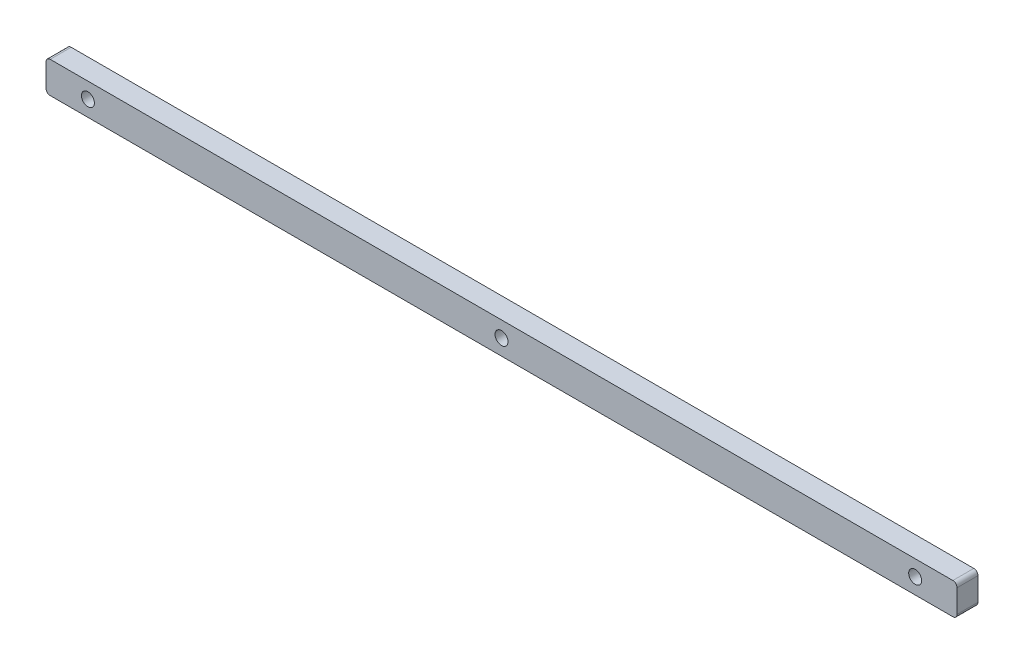
ISO-10303-21;
HEADER;
FILE_DESCRIPTION(('STEP AP214'),'2;1');
FILE_NAME('part.step','',(''),(''),'','','');
FILE_SCHEMA(('AUTOMOTIVE_DESIGN { 1 0 10303 214 1 1 1 1 }'));
ENDSEC;
DATA;
#1=APPLICATION_CONTEXT('core data for automotive mechanical design processes');
#2=APPLICATION_PROTOCOL_DEFINITION('international standard','automotive_design',2000,#1);
#3=PRODUCT_CONTEXT('',#1,'mechanical');
#4=PRODUCT('Part','Part','',(#3));
#5=PRODUCT_RELATED_PRODUCT_CATEGORY('part','',(#4));
#6=PRODUCT_DEFINITION_FORMATION('','',#4);
#7=PRODUCT_DEFINITION_CONTEXT('part definition',#1,'design');
#8=PRODUCT_DEFINITION('design','',#6,#7);
#9=PRODUCT_DEFINITION_SHAPE('','',#8);
#10=(LENGTH_UNIT() NAMED_UNIT(*) SI_UNIT(.MILLI.,.METRE.));
#11=(NAMED_UNIT(*) PLANE_ANGLE_UNIT() SI_UNIT($,.RADIAN.));
#12=(NAMED_UNIT(*) SI_UNIT($,.STERADIAN.) SOLID_ANGLE_UNIT());
#13=UNCERTAINTY_MEASURE_WITH_UNIT(LENGTH_MEASURE(1.E-05),#10,'distance_accuracy_value','');
#14=(GEOMETRIC_REPRESENTATION_CONTEXT(3) GLOBAL_UNCERTAINTY_ASSIGNED_CONTEXT((#13)) GLOBAL_UNIT_ASSIGNED_CONTEXT((#10,
#11,#12)) REPRESENTATION_CONTEXT('',''));
#15=CARTESIAN_POINT('',(0.,0.,0.));
#16=DIRECTION('',(0.,0.,1.));
#17=DIRECTION('',(1.,0.,0.));
#18=AXIS2_PLACEMENT_3D('',#15,#16,#17);
#19=CARTESIAN_POINT('',(0.,0.,6.35));
#20=DIRECTION('',(0.,0.,-1.));
#21=DIRECTION('',(-1.,0.,0.));
#22=AXIS2_PLACEMENT_3D('',#19,#20,#21);
#23=PLANE('',#22);
#24=DIRECTION('',(-1.,0.,0.));
#25=VECTOR('',#24,1.);
#26=CARTESIAN_POINT('',(-276.225,9.52500000000001,6.35));
#27=LINE('',#26,#25);
#28=CARTESIAN_POINT('',(273.685,9.52500000000001,6.35));
#29=VERTEX_POINT('',#28);
#30=CARTESIAN_POINT('',(-273.685,9.52500000000001,6.35));
#31=VERTEX_POINT('',#30);
#32=EDGE_CURVE('E194',#29,#31,#27,.T.);
#33=ORIENTED_EDGE('',*,*,#32,.T.);
#34=CARTESIAN_POINT('',(-273.685,6.985,6.35));
#35=DIRECTION('',(0.,0.,-1.));
#36=DIRECTION('',(-1.,0.,0.));
#37=AXIS2_PLACEMENT_3D('',#34,#35,#36);
#38=CIRCLE('',#37,2.54);
#39=CARTESIAN_POINT('',(-276.225,6.985,6.35));
#40=VERTEX_POINT('',#39);
#41=EDGE_CURVE('E170',#31,#40,#38,.F.);
#42=ORIENTED_EDGE('',*,*,#41,.T.);
#43=DIRECTION('',(0.,-1.,0.));
#44=VECTOR('',#43,1.);
#45=CARTESIAN_POINT('',(-276.225,-9.52499999999999,6.35));
#46=LINE('',#45,#44);
#47=CARTESIAN_POINT('',(-276.225,-6.98499999999999,6.35));
#48=VERTEX_POINT('',#47);
#49=EDGE_CURVE('E127',#40,#48,#46,.T.);
#50=ORIENTED_EDGE('',*,*,#49,.T.);
#51=CARTESIAN_POINT('',(-273.685,-6.98499999999999,6.35));
#52=DIRECTION('',(0.,0.,-1.));
#53=DIRECTION('',(-1.,0.,0.));
#54=AXIS2_PLACEMENT_3D('',#51,#52,#53);
#55=CIRCLE('',#54,2.54);
#56=CARTESIAN_POINT('',(-273.685,-9.52499999999999,6.35));
#57=VERTEX_POINT('',#56);
#58=EDGE_CURVE('E62',#48,#57,#55,.F.);
#59=ORIENTED_EDGE('',*,*,#58,.T.);
#60=DIRECTION('',(1.,0.,0.));
#61=VECTOR('',#60,1.);
#62=CARTESIAN_POINT('',(-276.225,-9.52499999999999,6.35));
#63=LINE('',#62,#61);
#64=CARTESIAN_POINT('',(273.685,-9.52499999999999,6.35));
#65=VERTEX_POINT('',#64);
#66=EDGE_CURVE('E148',#57,#65,#63,.T.);
#67=ORIENTED_EDGE('',*,*,#66,.T.);
#68=CARTESIAN_POINT('',(273.685,-6.98499999999999,6.35));
#69=DIRECTION('',(0.,0.,-1.));
#70=DIRECTION('',(-1.,0.,0.));
#71=AXIS2_PLACEMENT_3D('',#68,#69,#70);
#72=CIRCLE('',#71,2.54);
#73=CARTESIAN_POINT('',(276.225,-6.98499999999999,6.35));
#74=VERTEX_POINT('',#73);
#75=EDGE_CURVE('E165',#65,#74,#72,.F.);
#76=ORIENTED_EDGE('',*,*,#75,.T.);
#77=DIRECTION('',(0.,1.,0.));
#78=VECTOR('',#77,1.);
#79=CARTESIAN_POINT('',(276.225,-9.52499999999999,6.35));
#80=LINE('',#79,#78);
#81=CARTESIAN_POINT('',(276.225,6.985,6.35));
#82=VERTEX_POINT('',#81);
#83=EDGE_CURVE('E141',#74,#82,#80,.T.);
#84=ORIENTED_EDGE('',*,*,#83,.T.);
#85=CARTESIAN_POINT('',(273.685,6.985,6.35));
#86=DIRECTION('',(0.,0.,-1.));
#87=DIRECTION('',(-1.,0.,0.));
#88=AXIS2_PLACEMENT_3D('',#85,#86,#87);
#89=CIRCLE('',#88,2.54);
#90=EDGE_CURVE('E162',#82,#29,#89,.F.);
#91=ORIENTED_EDGE('',*,*,#90,.T.);
#92=EDGE_LOOP('',(#33,#42,#50,#59,#67,#76,#84,#91));
#93=FACE_BOUND('',#92,.T.);
#94=CARTESIAN_POINT('',(0.,0.,6.35));
#95=DIRECTION('',(0.,0.,1.));
#96=DIRECTION('',(1.,0.,0.));
#97=AXIS2_PLACEMENT_3D('',#94,#95,#96);
#98=CIRCLE('',#97,3.937);
#99=CARTESIAN_POINT('',(3.937,0.,6.35));
#100=VERTEX_POINT('',#99);
#101=EDGE_CURVE('E200',#100,#100,#98,.T.);
#102=ORIENTED_EDGE('',*,*,#101,.F.);
#103=EDGE_LOOP('',(#102));
#104=FACE_BOUND('',#103,.T.);
#105=CARTESIAN_POINT('',(-250.825,0.,6.35));
#106=DIRECTION('',(0.,0.,1.));
#107=DIRECTION('',(1.,0.,0.));
#108=AXIS2_PLACEMENT_3D('',#105,#106,#107);
#109=CIRCLE('',#108,3.937);
#110=CARTESIAN_POINT('',(-246.888,0.,6.35));
#111=VERTEX_POINT('',#110);
#112=EDGE_CURVE('E214',#111,#111,#109,.T.);
#113=ORIENTED_EDGE('',*,*,#112,.F.);
#114=EDGE_LOOP('',(#113));
#115=FACE_BOUND('',#114,.T.);
#116=CARTESIAN_POINT('',(250.825,0.,6.35));
#117=DIRECTION('',(0.,0.,1.));
#118=DIRECTION('',(1.,0.,0.));
#119=AXIS2_PLACEMENT_3D('',#116,#117,#118);
#120=CIRCLE('',#119,3.937);
#121=CARTESIAN_POINT('',(254.762,0.,6.35));
#122=VERTEX_POINT('',#121);
#123=EDGE_CURVE('E220',#122,#122,#120,.T.);
#124=ORIENTED_EDGE('',*,*,#123,.F.);
#125=EDGE_LOOP('',(#124));
#126=FACE_BOUND('',#125,.T.);
#127=ADVANCED_FACE('F39',(#93,#104,#115,#126),#23,.F.);
#128=CARTESIAN_POINT('',(0.,0.,-6.35));
#129=DIRECTION('',(0.,0.,-1.));
#130=DIRECTION('',(-1.,0.,0.));
#131=AXIS2_PLACEMENT_3D('',#128,#129,#130);
#132=PLANE('',#131);
#133=CARTESIAN_POINT('',(-250.825,0.,-6.35));
#134=DIRECTION('',(0.,0.,1.));
#135=DIRECTION('',(1.,0.,0.));
#136=AXIS2_PLACEMENT_3D('',#133,#134,#135);
#137=CIRCLE('',#136,3.937);
#138=CARTESIAN_POINT('',(-246.888,0.,-6.35));
#139=VERTEX_POINT('',#138);
#140=EDGE_CURVE('E216',#139,#139,#137,.T.);
#141=ORIENTED_EDGE('',*,*,#140,.T.);
#142=EDGE_LOOP('',(#141));
#143=FACE_BOUND('',#142,.T.);
#144=DIRECTION('',(0.,-1.,0.));
#145=VECTOR('',#144,1.);
#146=CARTESIAN_POINT('',(-276.225,-9.52499999999999,-6.35));
#147=LINE('',#146,#145);
#148=CARTESIAN_POINT('',(-276.225,6.985,-6.35));
#149=VERTEX_POINT('',#148);
#150=CARTESIAN_POINT('',(-276.225,-6.98499999999999,-6.35));
#151=VERTEX_POINT('',#150);
#152=EDGE_CURVE('E125',#149,#151,#147,.T.);
#153=ORIENTED_EDGE('',*,*,#152,.F.);
#154=CARTESIAN_POINT('',(-273.685,6.985,-6.35));
#155=DIRECTION('',(0.,0.,-1.));
#156=DIRECTION('',(-1.,0.,0.));
#157=AXIS2_PLACEMENT_3D('',#154,#155,#156);
#158=CIRCLE('',#157,2.54);
#159=CARTESIAN_POINT('',(-273.685,9.52500000000001,-6.35));
#160=VERTEX_POINT('',#159);
#161=EDGE_CURVE('E107',#149,#160,#158,.T.);
#162=ORIENTED_EDGE('',*,*,#161,.T.);
#163=DIRECTION('',(-1.,0.,0.));
#164=VECTOR('',#163,1.);
#165=CARTESIAN_POINT('',(-276.225,9.52500000000001,-6.35));
#166=LINE('',#165,#164);
#167=CARTESIAN_POINT('',(273.685,9.52500000000001,-6.35));
#168=VERTEX_POINT('',#167);
#169=EDGE_CURVE('E137',#168,#160,#166,.T.);
#170=ORIENTED_EDGE('',*,*,#169,.F.);
#171=CARTESIAN_POINT('',(273.685,6.985,-6.35));
#172=DIRECTION('',(0.,0.,-1.));
#173=DIRECTION('',(-1.,0.,0.));
#174=AXIS2_PLACEMENT_3D('',#171,#172,#173);
#175=CIRCLE('',#174,2.54);
#176=CARTESIAN_POINT('',(276.225,6.985,-6.35));
#177=VERTEX_POINT('',#176);
#178=EDGE_CURVE('E129',#168,#177,#175,.T.);
#179=ORIENTED_EDGE('',*,*,#178,.T.);
#180=DIRECTION('',(0.,1.,0.));
#181=VECTOR('',#180,1.);
#182=CARTESIAN_POINT('',(276.225,-9.52499999999999,-6.35));
#183=LINE('',#182,#181);
#184=CARTESIAN_POINT('',(276.225,-6.98499999999999,-6.35));
#185=VERTEX_POINT('',#184);
#186=EDGE_CURVE('E143',#185,#177,#183,.T.);
#187=ORIENTED_EDGE('',*,*,#186,.F.);
#188=CARTESIAN_POINT('',(273.685,-6.98499999999999,-6.35));
#189=DIRECTION('',(0.,0.,-1.));
#190=DIRECTION('',(-1.,0.,0.));
#191=AXIS2_PLACEMENT_3D('',#188,#189,#190);
#192=CIRCLE('',#191,2.54);
#193=CARTESIAN_POINT('',(273.685,-9.52499999999999,-6.35));
#194=VERTEX_POINT('',#193);
#195=EDGE_CURVE('E152',#185,#194,#192,.T.);
#196=ORIENTED_EDGE('',*,*,#195,.T.);
#197=DIRECTION('',(1.,0.,0.));
#198=VECTOR('',#197,1.);
#199=CARTESIAN_POINT('',(-276.225,-9.52499999999999,-6.35));
#200=LINE('',#199,#198);
#201=CARTESIAN_POINT('',(-273.685,-9.52499999999999,-6.35));
#202=VERTEX_POINT('',#201);
#203=EDGE_CURVE('E136',#202,#194,#200,.T.);
#204=ORIENTED_EDGE('',*,*,#203,.F.);
#205=CARTESIAN_POINT('',(-273.685,-6.98499999999999,-6.35));
#206=DIRECTION('',(0.,0.,-1.));
#207=DIRECTION('',(-1.,0.,0.));
#208=AXIS2_PLACEMENT_3D('',#205,#206,#207);
#209=CIRCLE('',#208,2.54);
#210=EDGE_CURVE('E119',#202,#151,#209,.T.);
#211=ORIENTED_EDGE('',*,*,#210,.T.);
#212=EDGE_LOOP('',(#153,#162,#170,#179,#187,#196,#204,#211));
#213=FACE_BOUND('',#212,.T.);
#214=CARTESIAN_POINT('',(0.,0.,-6.35));
#215=DIRECTION('',(0.,0.,1.));
#216=DIRECTION('',(1.,0.,0.));
#217=AXIS2_PLACEMENT_3D('',#214,#215,#216);
#218=CIRCLE('',#217,3.937);
#219=CARTESIAN_POINT('',(3.937,0.,-6.35));
#220=VERTEX_POINT('',#219);
#221=EDGE_CURVE('E203',#220,#220,#218,.T.);
#222=ORIENTED_EDGE('',*,*,#221,.T.);
#223=EDGE_LOOP('',(#222));
#224=FACE_BOUND('',#223,.T.);
#225=CARTESIAN_POINT('',(250.825,0.,-6.35));
#226=DIRECTION('',(0.,0.,1.));
#227=DIRECTION('',(1.,0.,0.));
#228=AXIS2_PLACEMENT_3D('',#225,#226,#227);
#229=CIRCLE('',#228,3.937);
#230=CARTESIAN_POINT('',(254.762,0.,-6.35));
#231=VERTEX_POINT('',#230);
#232=EDGE_CURVE('E224',#231,#231,#229,.T.);
#233=ORIENTED_EDGE('',*,*,#232,.T.);
#234=EDGE_LOOP('',(#233));
#235=FACE_BOUND('',#234,.T.);
#236=ADVANCED_FACE('F132',(#143,#213,#224,#235),#132,.T.);
#237=CARTESIAN_POINT('',(276.225,-9.52499999999999,6.35));
#238=DIRECTION('',(-1.,0.,0.));
#239=DIRECTION('',(0.,0.,1.));
#240=AXIS2_PLACEMENT_3D('',#237,#238,#239);
#241=PLANE('',#240);
#242=ORIENTED_EDGE('',*,*,#83,.F.);
#243=DIRECTION('',(0.,0.,-1.));
#244=VECTOR('',#243,1.);
#245=CARTESIAN_POINT('',(276.225,-6.98499999999999,6.35));
#246=LINE('',#245,#244);
#247=EDGE_CURVE('E11',#74,#185,#246,.T.);
#248=ORIENTED_EDGE('',*,*,#247,.T.);
#249=ORIENTED_EDGE('',*,*,#186,.T.);
#250=DIRECTION('',(0.,0.,-1.));
#251=VECTOR('',#250,1.);
#252=CARTESIAN_POINT('',(276.225,6.985,6.35));
#253=LINE('',#252,#251);
#254=EDGE_CURVE('E48',#177,#82,#253,.F.);
#255=ORIENTED_EDGE('',*,*,#254,.T.);
#256=EDGE_LOOP('',(#242,#248,#249,#255));
#257=FACE_BOUND('',#256,.T.);
#258=ADVANCED_FACE('F184',(#257),#241,.F.);
#259=CARTESIAN_POINT('',(-276.225,9.52500000000001,6.35));
#260=DIRECTION('',(0.,-1.,0.));
#261=DIRECTION('',(0.,0.,-1.));
#262=AXIS2_PLACEMENT_3D('',#259,#260,#261);
#263=PLANE('',#262);
#264=ORIENTED_EDGE('',*,*,#169,.T.);
#265=DIRECTION('',(0.,0.,-1.));
#266=VECTOR('',#265,1.);
#267=CARTESIAN_POINT('',(-273.685,9.52500000000001,6.35));
#268=LINE('',#267,#266);
#269=EDGE_CURVE('E112',#160,#31,#268,.F.);
#270=ORIENTED_EDGE('',*,*,#269,.T.);
#271=ORIENTED_EDGE('',*,*,#32,.F.);
#272=DIRECTION('',(0.,0.,-1.));
#273=VECTOR('',#272,1.);
#274=CARTESIAN_POINT('',(273.685,9.52500000000001,6.35));
#275=LINE('',#274,#273);
#276=EDGE_CURVE('E118',#29,#168,#275,.T.);
#277=ORIENTED_EDGE('',*,*,#276,.T.);
#278=EDGE_LOOP('',(#264,#270,#271,#277));
#279=FACE_BOUND('',#278,.T.);
#280=ADVANCED_FACE('F198',(#279),#263,.F.);
#281=CARTESIAN_POINT('',(-276.225,-9.52499999999999,6.35));
#282=DIRECTION('',(1.,0.,0.));
#283=DIRECTION('',(0.,0.,-1.));
#284=AXIS2_PLACEMENT_3D('',#281,#282,#283);
#285=PLANE('',#284);
#286=ORIENTED_EDGE('',*,*,#49,.F.);
#287=DIRECTION('',(0.,0.,-1.));
#288=VECTOR('',#287,1.);
#289=CARTESIAN_POINT('',(-276.225,6.985,6.35));
#290=LINE('',#289,#288);
#291=EDGE_CURVE('E111',#40,#149,#290,.T.);
#292=ORIENTED_EDGE('',*,*,#291,.T.);
#293=ORIENTED_EDGE('',*,*,#152,.T.);
#294=DIRECTION('',(0.,0.,-1.));
#295=VECTOR('',#294,1.);
#296=CARTESIAN_POINT('',(-276.225,-6.98499999999999,6.35));
#297=LINE('',#296,#295);
#298=EDGE_CURVE('E130',#151,#48,#297,.F.);
#299=ORIENTED_EDGE('',*,*,#298,.T.);
#300=EDGE_LOOP('',(#286,#292,#293,#299));
#301=FACE_BOUND('',#300,.T.);
#302=ADVANCED_FACE('F124',(#301),#285,.F.);
#303=CARTESIAN_POINT('',(-276.225,-9.52499999999999,6.35));
#304=DIRECTION('',(0.,1.,0.));
#305=DIRECTION('',(0.,0.,1.));
#306=AXIS2_PLACEMENT_3D('',#303,#304,#305);
#307=PLANE('',#306);
#308=ORIENTED_EDGE('',*,*,#66,.F.);
#309=DIRECTION('',(0.,0.,-1.));
#310=VECTOR('',#309,1.);
#311=CARTESIAN_POINT('',(-273.685,-9.52499999999999,6.35));
#312=LINE('',#311,#310);
#313=EDGE_CURVE('E175',#57,#202,#312,.T.);
#314=ORIENTED_EDGE('',*,*,#313,.T.);
#315=ORIENTED_EDGE('',*,*,#203,.T.);
#316=DIRECTION('',(0.,0.,-1.));
#317=VECTOR('',#316,1.);
#318=CARTESIAN_POINT('',(273.685,-9.52499999999999,6.35));
#319=LINE('',#318,#317);
#320=EDGE_CURVE('E55',#194,#65,#319,.F.);
#321=ORIENTED_EDGE('',*,*,#320,.T.);
#322=EDGE_LOOP('',(#308,#314,#315,#321));
#323=FACE_BOUND('',#322,.T.);
#324=ADVANCED_FACE('F246',(#323),#307,.F.);
#325=CARTESIAN_POINT('',(0.,0.,6.35));
#326=DIRECTION('',(0.,0.,-1.));
#327=DIRECTION('',(-1.,0.,0.));
#328=AXIS2_PLACEMENT_3D('',#325,#326,#327);
#329=CYLINDRICAL_SURFACE('',#328,3.937);
#330=ORIENTED_EDGE('',*,*,#101,.T.);
#331=EDGE_LOOP('',(#330));
#332=FACE_BOUND('',#331,.T.);
#333=ORIENTED_EDGE('',*,*,#221,.F.);
#334=EDGE_LOOP('',(#333));
#335=FACE_BOUND('',#334,.T.);
#336=ADVANCED_FACE('F243',(#332,#335),#329,.F.);
#337=CARTESIAN_POINT('',(-250.825,0.,6.35));
#338=DIRECTION('',(0.,0.,-1.));
#339=DIRECTION('',(-1.,0.,0.));
#340=AXIS2_PLACEMENT_3D('',#337,#338,#339);
#341=CYLINDRICAL_SURFACE('',#340,3.937);
#342=ORIENTED_EDGE('',*,*,#112,.T.);
#343=EDGE_LOOP('',(#342));
#344=FACE_BOUND('',#343,.T.);
#345=ORIENTED_EDGE('',*,*,#140,.F.);
#346=EDGE_LOOP('',(#345));
#347=FACE_BOUND('',#346,.T.);
#348=ADVANCED_FACE('F329',(#344,#347),#341,.F.);
#349=CARTESIAN_POINT('',(250.825,0.,6.35));
#350=DIRECTION('',(0.,0.,-1.));
#351=DIRECTION('',(-1.,0.,0.));
#352=AXIS2_PLACEMENT_3D('',#349,#350,#351);
#353=CYLINDRICAL_SURFACE('',#352,3.937);
#354=ORIENTED_EDGE('',*,*,#123,.T.);
#355=EDGE_LOOP('',(#354));
#356=FACE_BOUND('',#355,.T.);
#357=ORIENTED_EDGE('',*,*,#232,.F.);
#358=EDGE_LOOP('',(#357));
#359=FACE_BOUND('',#358,.T.);
#360=ADVANCED_FACE('F232',(#356,#359),#353,.F.);
#361=CARTESIAN_POINT('',(-273.685,6.985,6.35));
#362=DIRECTION('',(0.,0.,-1.));
#363=DIRECTION('',(-1.,0.,0.));
#364=AXIS2_PLACEMENT_3D('',#361,#362,#363);
#365=CYLINDRICAL_SURFACE('',#364,2.54);
#366=ORIENTED_EDGE('',*,*,#41,.F.);
#367=ORIENTED_EDGE('',*,*,#269,.F.);
#368=ORIENTED_EDGE('',*,*,#161,.F.);
#369=ORIENTED_EDGE('',*,*,#291,.F.);
#370=EDGE_LOOP('',(#366,#367,#368,#369));
#371=FACE_BOUND('',#370,.T.);
#372=ADVANCED_FACE('F110',(#371),#365,.T.);
#373=CARTESIAN_POINT('',(-273.685,-6.98499999999999,6.35));
#374=DIRECTION('',(0.,0.,-1.));
#375=DIRECTION('',(-1.,0.,0.));
#376=AXIS2_PLACEMENT_3D('',#373,#374,#375);
#377=CYLINDRICAL_SURFACE('',#376,2.54);
#378=ORIENTED_EDGE('',*,*,#58,.F.);
#379=ORIENTED_EDGE('',*,*,#298,.F.);
#380=ORIENTED_EDGE('',*,*,#210,.F.);
#381=ORIENTED_EDGE('',*,*,#313,.F.);
#382=EDGE_LOOP('',(#378,#379,#380,#381));
#383=FACE_BOUND('',#382,.T.);
#384=ADVANCED_FACE('F257',(#383),#377,.T.);
#385=CARTESIAN_POINT('',(273.685,-6.98499999999999,6.35));
#386=DIRECTION('',(0.,0.,-1.));
#387=DIRECTION('',(-1.,0.,0.));
#388=AXIS2_PLACEMENT_3D('',#385,#386,#387);
#389=CYLINDRICAL_SURFACE('',#388,2.54);
#390=ORIENTED_EDGE('',*,*,#75,.F.);
#391=ORIENTED_EDGE('',*,*,#320,.F.);
#392=ORIENTED_EDGE('',*,*,#195,.F.);
#393=ORIENTED_EDGE('',*,*,#247,.F.);
#394=EDGE_LOOP('',(#390,#391,#392,#393));
#395=FACE_BOUND('',#394,.T.);
#396=ADVANCED_FACE('F259',(#395),#389,.T.);
#397=CARTESIAN_POINT('',(273.685,6.985,6.35));
#398=DIRECTION('',(0.,0.,-1.));
#399=DIRECTION('',(-1.,0.,0.));
#400=AXIS2_PLACEMENT_3D('',#397,#398,#399);
#401=CYLINDRICAL_SURFACE('',#400,2.54);
#402=ORIENTED_EDGE('',*,*,#90,.F.);
#403=ORIENTED_EDGE('',*,*,#254,.F.);
#404=ORIENTED_EDGE('',*,*,#178,.F.);
#405=ORIENTED_EDGE('',*,*,#276,.F.);
#406=EDGE_LOOP('',(#402,#403,#404,#405));
#407=FACE_BOUND('',#406,.T.);
#408=ADVANCED_FACE('F41',(#407),#401,.T.);
#409=CLOSED_SHELL('',(#127,#236,#258,#280,#302,#324,#336,#348,#360,#372,#384,#396,#408));
#410=MANIFOLD_SOLID_BREP('B2',#409);
#411=ADVANCED_BREP_SHAPE_REPRESENTATION('',(#18,#410),#14);
#412=SHAPE_DEFINITION_REPRESENTATION(#9,#411);
ENDSEC;
END-ISO-10303-21;
